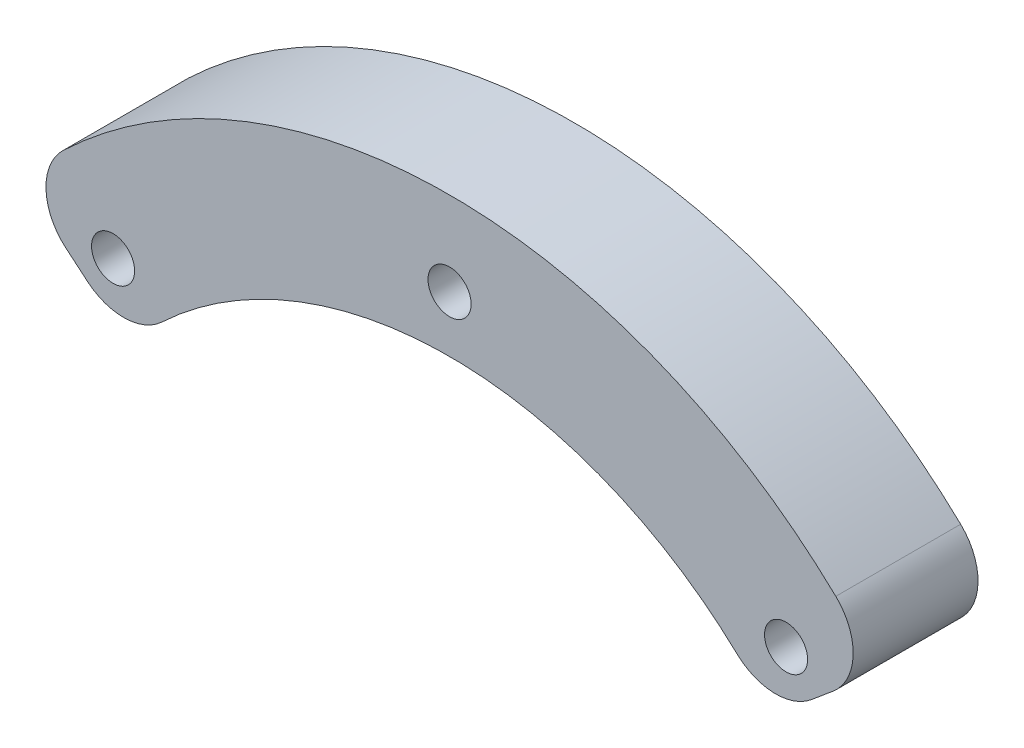
ISO-10303-21;
HEADER;
FILE_DESCRIPTION(('STEP AP214'),'2;1');
FILE_NAME('part.step','',(''),(''),'','','');
FILE_SCHEMA(('AUTOMOTIVE_DESIGN { 1 0 10303 214 1 1 1 1 }'));
ENDSEC;
DATA;
#1=APPLICATION_CONTEXT('core data for automotive mechanical design processes');
#2=APPLICATION_PROTOCOL_DEFINITION('international standard','automotive_design',2000,#1);
#3=PRODUCT_CONTEXT('',#1,'mechanical');
#4=PRODUCT('Part','Part','',(#3));
#5=PRODUCT_RELATED_PRODUCT_CATEGORY('part','',(#4));
#6=PRODUCT_DEFINITION_FORMATION('','',#4);
#7=PRODUCT_DEFINITION_CONTEXT('part definition',#1,'design');
#8=PRODUCT_DEFINITION('design','',#6,#7);
#9=PRODUCT_DEFINITION_SHAPE('','',#8);
#10=(LENGTH_UNIT() NAMED_UNIT(*) SI_UNIT(.MILLI.,.METRE.));
#11=(NAMED_UNIT(*) PLANE_ANGLE_UNIT() SI_UNIT($,.RADIAN.));
#12=(NAMED_UNIT(*) SI_UNIT($,.STERADIAN.) SOLID_ANGLE_UNIT());
#13=UNCERTAINTY_MEASURE_WITH_UNIT(LENGTH_MEASURE(1.E-05),#10,'distance_accuracy_value','');
#14=(GEOMETRIC_REPRESENTATION_CONTEXT(3) GLOBAL_UNCERTAINTY_ASSIGNED_CONTEXT((#13)) GLOBAL_UNIT_ASSIGNED_CONTEXT((#10,
#11,#12)) REPRESENTATION_CONTEXT('',''));
#15=CARTESIAN_POINT('',(0.,0.,0.));
#16=DIRECTION('',(0.,0.,1.));
#17=DIRECTION('',(1.,0.,0.));
#18=AXIS2_PLACEMENT_3D('',#15,#16,#17);
#19=CARTESIAN_POINT('',(0.,0.,-11.15));
#20=DIRECTION('',(-0.642787609686544,0.766044443118974,0.));
#21=DIRECTION('',(-0.766044443118974,-0.642787609686544,0.));
#22=AXIS2_PLACEMENT_3D('',#19,#20,#21);
#23=PLANE('',#22);
#24=DIRECTION('',(0.766044443118974,0.642787609686544,0.));
#25=VECTOR('',#24,1.);
#26=CARTESIAN_POINT('',(0.,0.,0.));
#27=LINE('',#26,#25);
#28=CARTESIAN_POINT('',(32.3307965914018,27.1287594955132,0.));
#29=VERTEX_POINT('',#28);
#30=CARTESIAN_POINT('',(34.258548972,28.7463358070743,0.));
#31=VERTEX_POINT('',#30);
#32=EDGE_CURVE('E123',#29,#31,#27,.T.);
#33=ORIENTED_EDGE('',*,*,#32,.F.);
#34=DIRECTION('',(0.,0.,-1.));
#35=VECTOR('',#34,1.);
#36=CARTESIAN_POINT('',(32.3307965914018,27.1287594955132,0.));
#37=LINE('',#36,#35);
#38=CARTESIAN_POINT('',(32.3307965914018,27.1287594955132,-11.15));
#39=VERTEX_POINT('',#38);
#40=EDGE_CURVE('E128',#39,#29,#37,.F.);
#41=ORIENTED_EDGE('',*,*,#40,.F.);
#42=DIRECTION('',(0.766044443118974,0.642787609686544,0.));
#43=VECTOR('',#42,1.);
#44=CARTESIAN_POINT('',(0.,0.,-11.15));
#45=LINE('',#44,#43);
#46=CARTESIAN_POINT('',(34.258548972,28.7463358070743,-11.15));
#47=VERTEX_POINT('',#46);
#48=EDGE_CURVE('E221',#39,#47,#45,.T.);
#49=ORIENTED_EDGE('',*,*,#48,.T.);
#50=DIRECTION('',(0.,0.,1.));
#51=VECTOR('',#50,1.);
#52=CARTESIAN_POINT('',(34.258548972,28.7463358070743,-11.15));
#53=LINE('',#52,#51);
#54=EDGE_CURVE('E181',#31,#47,#53,.F.);
#55=ORIENTED_EDGE('',*,*,#54,.F.);
#56=EDGE_LOOP('',(#33,#41,#49,#55));
#57=FACE_BOUND('',#56,.T.);
#58=ADVANCED_FACE('F49',(#57),#23,.F.);
#59=CARTESIAN_POINT('',(0.,0.,-11.15));
#60=DIRECTION('',(0.,0.,1.));
#61=DIRECTION('',(-1.,0.,0.));
#62=AXIS2_PLACEMENT_3D('',#59,#60,#61);
#63=CYLINDRICAL_SURFACE('',#62,50.);
#64=CARTESIAN_POINT('',(0.,0.,-11.15));
#65=DIRECTION('',(0.,0.,1.));
#66=DIRECTION('',(1.,0.,0.));
#67=AXIS2_PLACEMENT_3D('',#64,#65,#66);
#68=CIRCLE('',#67,50.);
#69=CARTESIAN_POINT('',(34.4940121372969,36.1961755807435,-11.15));
#70=VERTEX_POINT('',#69);
#71=CARTESIAN_POINT('',(-34.494012137297,36.1961755807435,-11.15));
#72=VERTEX_POINT('',#71);
#73=EDGE_CURVE('E223',#70,#72,#68,.T.);
#74=ORIENTED_EDGE('',*,*,#73,.T.);
#75=DIRECTION('',(0.,0.,1.));
#76=VECTOR('',#75,1.);
#77=CARTESIAN_POINT('',(-34.494012137297,36.1961755807435,-11.15));
#78=LINE('',#77,#76);
#79=CARTESIAN_POINT('',(-34.494012137297,36.1961755807435,0.));
#80=VERTEX_POINT('',#79);
#81=EDGE_CURVE('E140',#80,#72,#78,.F.);
#82=ORIENTED_EDGE('',*,*,#81,.F.);
#83=CARTESIAN_POINT('',(0.,0.,0.));
#84=DIRECTION('',(0.,0.,1.));
#85=DIRECTION('',(1.,0.,0.));
#86=AXIS2_PLACEMENT_3D('',#83,#84,#85);
#87=CIRCLE('',#86,50.);
#88=CARTESIAN_POINT('',(34.4940121372969,36.1961755807435,0.));
#89=VERTEX_POINT('',#88);
#90=EDGE_CURVE('E120',#89,#80,#87,.T.);
#91=ORIENTED_EDGE('',*,*,#90,.F.);
#92=DIRECTION('',(0.,0.,1.));
#93=VECTOR('',#92,1.);
#94=CARTESIAN_POINT('',(34.4940121372969,36.1961755807435,-11.15));
#95=LINE('',#94,#93);
#96=EDGE_CURVE('E132',#70,#89,#95,.T.);
#97=ORIENTED_EDGE('',*,*,#96,.F.);
#98=EDGE_LOOP('',(#74,#82,#91,#97));
#99=FACE_BOUND('',#98,.T.);
#100=ADVANCED_FACE('F142',(#99),#63,.T.);
#101=CARTESIAN_POINT('',(0.,0.,-11.15));
#102=DIRECTION('',(-0.642787609686543,-0.766044443118975,0.));
#103=DIRECTION('',(0.766044443118975,-0.642787609686543,0.));
#104=AXIS2_PLACEMENT_3D('',#101,#102,#103);
#105=PLANE('',#104);
#106=DIRECTION('',(-0.766044443118975,0.642787609686543,0.));
#107=VECTOR('',#106,1.);
#108=CARTESIAN_POINT('',(0.,0.,0.));
#109=LINE('',#108,#107);
#110=CARTESIAN_POINT('',(-32.3307965914018,27.1287594955132,0.));
#111=VERTEX_POINT('',#110);
#112=CARTESIAN_POINT('',(-34.258548972,28.7463358070743,0.));
#113=VERTEX_POINT('',#112);
#114=EDGE_CURVE('E145',#111,#113,#109,.T.);
#115=ORIENTED_EDGE('',*,*,#114,.T.);
#116=DIRECTION('',(0.,0.,-1.));
#117=VECTOR('',#116,1.);
#118=CARTESIAN_POINT('',(-34.258548972,28.7463358070743,0.));
#119=LINE('',#118,#117);
#120=CARTESIAN_POINT('',(-34.258548972,28.7463358070743,-11.15));
#121=VERTEX_POINT('',#120);
#122=EDGE_CURVE('E58',#121,#113,#119,.F.);
#123=ORIENTED_EDGE('',*,*,#122,.F.);
#124=DIRECTION('',(-0.766044443118975,0.642787609686543,0.));
#125=VECTOR('',#124,1.);
#126=CARTESIAN_POINT('',(0.,0.,-11.15));
#127=LINE('',#126,#125);
#128=CARTESIAN_POINT('',(-32.3307965914018,27.1287594955132,-11.15));
#129=VERTEX_POINT('',#128);
#130=EDGE_CURVE('E227',#129,#121,#127,.T.);
#131=ORIENTED_EDGE('',*,*,#130,.F.);
#132=DIRECTION('',(0.,0.,1.));
#133=VECTOR('',#132,1.);
#134=CARTESIAN_POINT('',(-32.3307965914018,27.1287594955132,-11.15));
#135=LINE('',#134,#133);
#136=EDGE_CURVE('E11',#111,#129,#135,.F.);
#137=ORIENTED_EDGE('',*,*,#136,.F.);
#138=EDGE_LOOP('',(#115,#123,#131,#137));
#139=FACE_BOUND('',#138,.T.);
#140=ADVANCED_FACE('F207',(#139),#105,.T.);
#141=CARTESIAN_POINT('',(-30.0520382004283,30.0520382004283,-11.15));
#142=DIRECTION('',(0.,0.,1.));
#143=DIRECTION('',(-1.,0.,0.));
#144=AXIS2_PLACEMENT_3D('',#141,#142,#143);
#145=CYLINDRICAL_SURFACE('',#144,1.925);
#146=CARTESIAN_POINT('',(-30.0520382004283,30.0520382004283,-11.15));
#147=DIRECTION('',(0.,0.,1.));
#148=DIRECTION('',(1.,0.,0.));
#149=AXIS2_PLACEMENT_3D('',#146,#147,#148);
#150=CIRCLE('',#149,1.925);
#151=CARTESIAN_POINT('',(-28.1270382004283,30.0520382004283,-11.15));
#152=VERTEX_POINT('',#151);
#153=EDGE_CURVE('E236',#152,#152,#150,.T.);
#154=ORIENTED_EDGE('',*,*,#153,.F.);
#155=EDGE_LOOP('',(#154));
#156=FACE_BOUND('',#155,.T.);
#157=CARTESIAN_POINT('',(-30.0520382004283,30.0520382004283,0.));
#158=DIRECTION('',(0.,0.,1.));
#159=DIRECTION('',(1.,0.,0.));
#160=AXIS2_PLACEMENT_3D('',#157,#158,#159);
#161=CIRCLE('',#160,1.925);
#162=CARTESIAN_POINT('',(-28.1270382004283,30.0520382004283,0.));
#163=VERTEX_POINT('',#162);
#164=EDGE_CURVE('E159',#163,#163,#161,.T.);
#165=ORIENTED_EDGE('',*,*,#164,.T.);
#166=EDGE_LOOP('',(#165));
#167=FACE_BOUND('',#166,.T.);
#168=ADVANCED_FACE('F330',(#156,#167),#145,.F.);
#169=CARTESIAN_POINT('',(0.,0.,-11.15));
#170=DIRECTION('',(0.,0.,1.));
#171=DIRECTION('',(-1.,0.,0.));
#172=AXIS2_PLACEMENT_3D('',#169,#170,#171);
#173=CYLINDRICAL_SURFACE('',#172,37.5);
#174=CARTESIAN_POINT('',(0.,0.,0.));
#175=DIRECTION('',(0.,0.,1.));
#176=DIRECTION('',(1.,0.,0.));
#177=AXIS2_PLACEMENT_3D('',#174,#175,#176);
#178=CIRCLE('',#177,37.5);
#179=CARTESIAN_POINT('',(25.691345773208,27.3167485686248,0.));
#180=VERTEX_POINT('',#179);
#181=CARTESIAN_POINT('',(-25.6913457732081,27.3167485686248,0.));
#182=VERTEX_POINT('',#181);
#183=EDGE_CURVE('E150',#180,#182,#178,.T.);
#184=ORIENTED_EDGE('',*,*,#183,.T.);
#185=DIRECTION('',(0.,0.,1.));
#186=VECTOR('',#185,1.);
#187=CARTESIAN_POINT('',(-25.6913457732081,27.3167485686248,-11.15));
#188=LINE('',#187,#186);
#189=CARTESIAN_POINT('',(-25.6913457732081,27.3167485686248,-11.15));
#190=VERTEX_POINT('',#189);
#191=EDGE_CURVE('E193',#190,#182,#188,.T.);
#192=ORIENTED_EDGE('',*,*,#191,.F.);
#193=CARTESIAN_POINT('',(0.,0.,-11.15));
#194=DIRECTION('',(0.,0.,1.));
#195=DIRECTION('',(1.,0.,0.));
#196=AXIS2_PLACEMENT_3D('',#193,#194,#195);
#197=CIRCLE('',#196,37.5);
#198=CARTESIAN_POINT('',(25.691345773208,27.3167485686248,-11.15));
#199=VERTEX_POINT('',#198);
#200=EDGE_CURVE('E215',#199,#190,#197,.T.);
#201=ORIENTED_EDGE('',*,*,#200,.F.);
#202=DIRECTION('',(0.,0.,1.));
#203=VECTOR('',#202,1.);
#204=CARTESIAN_POINT('',(25.691345773208,27.3167485686248,-11.15));
#205=LINE('',#204,#203);
#206=EDGE_CURVE('E196',#180,#199,#205,.F.);
#207=ORIENTED_EDGE('',*,*,#206,.F.);
#208=EDGE_LOOP('',(#184,#192,#201,#207));
#209=FACE_BOUND('',#208,.T.);
#210=ADVANCED_FACE('F214',(#209),#173,.F.);
#211=CARTESIAN_POINT('',(0.,42.5,-11.15));
#212=DIRECTION('',(0.,0.,1.));
#213=DIRECTION('',(-1.,0.,0.));
#214=AXIS2_PLACEMENT_3D('',#211,#212,#213);
#215=CYLINDRICAL_SURFACE('',#214,1.925);
#216=CARTESIAN_POINT('',(0.,42.5,-11.15));
#217=DIRECTION('',(0.,0.,1.));
#218=DIRECTION('',(1.,0.,0.));
#219=AXIS2_PLACEMENT_3D('',#216,#217,#218);
#220=CIRCLE('',#219,1.925);
#221=CARTESIAN_POINT('',(1.92499999999999,42.5,-11.15));
#222=VERTEX_POINT('',#221);
#223=EDGE_CURVE('E167',#222,#222,#220,.T.);
#224=ORIENTED_EDGE('',*,*,#223,.F.);
#225=EDGE_LOOP('',(#224));
#226=FACE_BOUND('',#225,.T.);
#227=CARTESIAN_POINT('',(0.,42.5,0.));
#228=DIRECTION('',(0.,0.,1.));
#229=DIRECTION('',(1.,0.,0.));
#230=AXIS2_PLACEMENT_3D('',#227,#228,#229);
#231=CIRCLE('',#230,1.925);
#232=CARTESIAN_POINT('',(1.92499999999999,42.5,0.));
#233=VERTEX_POINT('',#232);
#234=EDGE_CURVE('E152',#233,#233,#231,.T.);
#235=ORIENTED_EDGE('',*,*,#234,.T.);
#236=EDGE_LOOP('',(#235));
#237=FACE_BOUND('',#236,.T.);
#238=ADVANCED_FACE('F246',(#226,#237),#215,.F.);
#239=CARTESIAN_POINT('',(30.0520382004283,30.0520382004283,-11.15));
#240=DIRECTION('',(0.,0.,1.));
#241=DIRECTION('',(-1.,0.,0.));
#242=AXIS2_PLACEMENT_3D('',#239,#240,#241);
#243=CYLINDRICAL_SURFACE('',#242,1.925);
#244=CARTESIAN_POINT('',(30.0520382004283,30.0520382004283,-11.15));
#245=DIRECTION('',(0.,0.,1.));
#246=DIRECTION('',(1.,0.,0.));
#247=AXIS2_PLACEMENT_3D('',#244,#245,#246);
#248=CIRCLE('',#247,1.925);
#249=CARTESIAN_POINT('',(31.9770382004283,30.0520382004283,-11.15));
#250=VERTEX_POINT('',#249);
#251=EDGE_CURVE('E169',#250,#250,#248,.T.);
#252=ORIENTED_EDGE('',*,*,#251,.F.);
#253=EDGE_LOOP('',(#252));
#254=FACE_BOUND('',#253,.T.);
#255=CARTESIAN_POINT('',(30.0520382004283,30.0520382004283,0.));
#256=DIRECTION('',(0.,0.,1.));
#257=DIRECTION('',(1.,0.,0.));
#258=AXIS2_PLACEMENT_3D('',#255,#256,#257);
#259=CIRCLE('',#258,1.925);
#260=CARTESIAN_POINT('',(31.9770382004283,30.0520382004283,0.));
#261=VERTEX_POINT('',#260);
#262=EDGE_CURVE('E163',#261,#261,#259,.T.);
#263=ORIENTED_EDGE('',*,*,#262,.T.);
#264=EDGE_LOOP('',(#263));
#265=FACE_BOUND('',#264,.T.);
#266=ADVANCED_FACE('F256',(#254,#265),#243,.F.);
#267=CARTESIAN_POINT('',(0.,0.,-11.15));
#268=DIRECTION('',(0.,0.,-1.));
#269=DIRECTION('',(1.,0.,0.));
#270=AXIS2_PLACEMENT_3D('',#267,#268,#269);
#271=PLANE('',#270);
#272=ORIENTED_EDGE('',*,*,#223,.T.);
#273=EDGE_LOOP('',(#272));
#274=FACE_BOUND('',#273,.T.);
#275=ORIENTED_EDGE('',*,*,#48,.F.);
#276=CARTESIAN_POINT('',(29.1168585429691,30.9589817111081,-11.15));
#277=DIRECTION('',(0.,0.,1.));
#278=DIRECTION('',(1.,0.,0.));
#279=AXIS2_PLACEMENT_3D('',#276,#277,#278);
#280=CIRCLE('',#279,5.);
#281=EDGE_CURVE('E71',#199,#39,#280,.T.);
#282=ORIENTED_EDGE('',*,*,#281,.F.);
#283=ORIENTED_EDGE('',*,*,#200,.T.);
#284=CARTESIAN_POINT('',(-29.1168585429691,30.9589817111081,-11.15));
#285=DIRECTION('',(0.,0.,1.));
#286=DIRECTION('',(1.,0.,0.));
#287=AXIS2_PLACEMENT_3D('',#284,#285,#286);
#288=CIRCLE('',#287,5.);
#289=EDGE_CURVE('E64',#129,#190,#288,.T.);
#290=ORIENTED_EDGE('',*,*,#289,.F.);
#291=ORIENTED_EDGE('',*,*,#130,.T.);
#292=CARTESIAN_POINT('',(-31.0446109235673,32.5765580226691,-11.15));
#293=DIRECTION('',(0.,0.,1.));
#294=DIRECTION('',(1.,0.,0.));
#295=AXIS2_PLACEMENT_3D('',#292,#293,#294);
#296=CIRCLE('',#295,5.);
#297=EDGE_CURVE('E184',#72,#121,#296,.T.);
#298=ORIENTED_EDGE('',*,*,#297,.F.);
#299=ORIENTED_EDGE('',*,*,#73,.F.);
#300=CARTESIAN_POINT('',(31.0446109235672,32.5765580226692,-11.15));
#301=DIRECTION('',(0.,0.,1.));
#302=DIRECTION('',(1.,0.,0.));
#303=AXIS2_PLACEMENT_3D('',#300,#301,#302);
#304=CIRCLE('',#303,5.);
#305=EDGE_CURVE('E134',#47,#70,#304,.T.);
#306=ORIENTED_EDGE('',*,*,#305,.F.);
#307=EDGE_LOOP('',(#275,#282,#283,#290,#291,#298,#299,#306));
#308=FACE_BOUND('',#307,.T.);
#309=ORIENTED_EDGE('',*,*,#153,.T.);
#310=EDGE_LOOP('',(#309));
#311=FACE_BOUND('',#310,.T.);
#312=ORIENTED_EDGE('',*,*,#251,.T.);
#313=EDGE_LOOP('',(#312));
#314=FACE_BOUND('',#313,.T.);
#315=ADVANCED_FACE('F249',(#274,#308,#311,#314),#271,.T.);
#316=CARTESIAN_POINT('',(0.,0.,0.));
#317=DIRECTION('',(0.,0.,-1.));
#318=DIRECTION('',(1.,0.,0.));
#319=AXIS2_PLACEMENT_3D('',#316,#317,#318);
#320=PLANE('',#319);
#321=ORIENTED_EDGE('',*,*,#234,.F.);
#322=EDGE_LOOP('',(#321));
#323=FACE_BOUND('',#322,.T.);
#324=ORIENTED_EDGE('',*,*,#90,.T.);
#325=CARTESIAN_POINT('',(-31.0446109235673,32.5765580226691,0.));
#326=DIRECTION('',(0.,0.,1.));
#327=DIRECTION('',(1.,0.,0.));
#328=AXIS2_PLACEMENT_3D('',#325,#326,#327);
#329=CIRCLE('',#328,5.);
#330=EDGE_CURVE('E139',#113,#80,#329,.F.);
#331=ORIENTED_EDGE('',*,*,#330,.F.);
#332=ORIENTED_EDGE('',*,*,#114,.F.);
#333=CARTESIAN_POINT('',(-29.1168585429691,30.9589817111081,0.));
#334=DIRECTION('',(0.,0.,1.));
#335=DIRECTION('',(1.,0.,0.));
#336=AXIS2_PLACEMENT_3D('',#333,#334,#335);
#337=CIRCLE('',#336,5.);
#338=EDGE_CURVE('E173',#182,#111,#337,.F.);
#339=ORIENTED_EDGE('',*,*,#338,.F.);
#340=ORIENTED_EDGE('',*,*,#183,.F.);
#341=CARTESIAN_POINT('',(29.1168585429691,30.9589817111081,0.));
#342=DIRECTION('',(0.,0.,1.));
#343=DIRECTION('',(1.,0.,0.));
#344=AXIS2_PLACEMENT_3D('',#341,#342,#343);
#345=CIRCLE('',#344,5.);
#346=EDGE_CURVE('E129',#29,#180,#345,.F.);
#347=ORIENTED_EDGE('',*,*,#346,.F.);
#348=ORIENTED_EDGE('',*,*,#32,.T.);
#349=CARTESIAN_POINT('',(31.0446109235672,32.5765580226692,0.));
#350=DIRECTION('',(0.,0.,1.));
#351=DIRECTION('',(1.,0.,0.));
#352=AXIS2_PLACEMENT_3D('',#349,#350,#351);
#353=CIRCLE('',#352,5.);
#354=EDGE_CURVE('E115',#89,#31,#353,.F.);
#355=ORIENTED_EDGE('',*,*,#354,.F.);
#356=EDGE_LOOP('',(#324,#331,#332,#339,#340,#347,#348,#355));
#357=FACE_BOUND('',#356,.T.);
#358=ORIENTED_EDGE('',*,*,#164,.F.);
#359=EDGE_LOOP('',(#358));
#360=FACE_BOUND('',#359,.T.);
#361=ORIENTED_EDGE('',*,*,#262,.F.);
#362=EDGE_LOOP('',(#361));
#363=FACE_BOUND('',#362,.T.);
#364=ADVANCED_FACE('F117',(#323,#357,#360,#363),#320,.F.);
#365=CARTESIAN_POINT('',(31.0446109235672,32.5765580226692,-11.15));
#366=DIRECTION('',(0.,0.,1.));
#367=DIRECTION('',(-1.,0.,0.));
#368=AXIS2_PLACEMENT_3D('',#365,#366,#367);
#369=CYLINDRICAL_SURFACE('',#368,5.);
#370=ORIENTED_EDGE('',*,*,#305,.T.);
#371=ORIENTED_EDGE('',*,*,#96,.T.);
#372=ORIENTED_EDGE('',*,*,#354,.T.);
#373=ORIENTED_EDGE('',*,*,#54,.T.);
#374=EDGE_LOOP('',(#370,#371,#372,#373));
#375=FACE_BOUND('',#374,.T.);
#376=ADVANCED_FACE('F133',(#375),#369,.T.);
#377=CARTESIAN_POINT('',(29.1168585429691,30.9589817111081,-11.15));
#378=DIRECTION('',(0.,0.,1.));
#379=DIRECTION('',(-1.,0.,0.));
#380=AXIS2_PLACEMENT_3D('',#377,#378,#379);
#381=CYLINDRICAL_SURFACE('',#380,5.);
#382=ORIENTED_EDGE('',*,*,#281,.T.);
#383=ORIENTED_EDGE('',*,*,#40,.T.);
#384=ORIENTED_EDGE('',*,*,#346,.T.);
#385=ORIENTED_EDGE('',*,*,#206,.T.);
#386=EDGE_LOOP('',(#382,#383,#384,#385));
#387=FACE_BOUND('',#386,.T.);
#388=ADVANCED_FACE('F217',(#387),#381,.T.);
#389=CARTESIAN_POINT('',(-29.1168585429691,30.9589817111081,-11.15));
#390=DIRECTION('',(0.,0.,1.));
#391=DIRECTION('',(-1.,0.,0.));
#392=AXIS2_PLACEMENT_3D('',#389,#390,#391);
#393=CYLINDRICAL_SURFACE('',#392,5.);
#394=ORIENTED_EDGE('',*,*,#289,.T.);
#395=ORIENTED_EDGE('',*,*,#191,.T.);
#396=ORIENTED_EDGE('',*,*,#338,.T.);
#397=ORIENTED_EDGE('',*,*,#136,.T.);
#398=EDGE_LOOP('',(#394,#395,#396,#397));
#399=FACE_BOUND('',#398,.T.);
#400=ADVANCED_FACE('F210',(#399),#393,.T.);
#401=CARTESIAN_POINT('',(-31.0446109235673,32.5765580226691,-11.15));
#402=DIRECTION('',(0.,0.,1.));
#403=DIRECTION('',(-1.,0.,0.));
#404=AXIS2_PLACEMENT_3D('',#401,#402,#403);
#405=CYLINDRICAL_SURFACE('',#404,5.);
#406=ORIENTED_EDGE('',*,*,#297,.T.);
#407=ORIENTED_EDGE('',*,*,#122,.T.);
#408=ORIENTED_EDGE('',*,*,#330,.T.);
#409=ORIENTED_EDGE('',*,*,#81,.T.);
#410=EDGE_LOOP('',(#406,#407,#408,#409));
#411=FACE_BOUND('',#410,.T.);
#412=ADVANCED_FACE('F51',(#411),#405,.T.);
#413=CLOSED_SHELL('',(#58,#100,#140,#168,#210,#238,#266,#315,#364,#376,#388,#400,#412));
#414=MANIFOLD_SOLID_BREP('B2',#413);
#415=ADVANCED_BREP_SHAPE_REPRESENTATION('',(#18,#414),#14);
#416=SHAPE_DEFINITION_REPRESENTATION(#9,#415);
ENDSEC;
END-ISO-10303-21;
